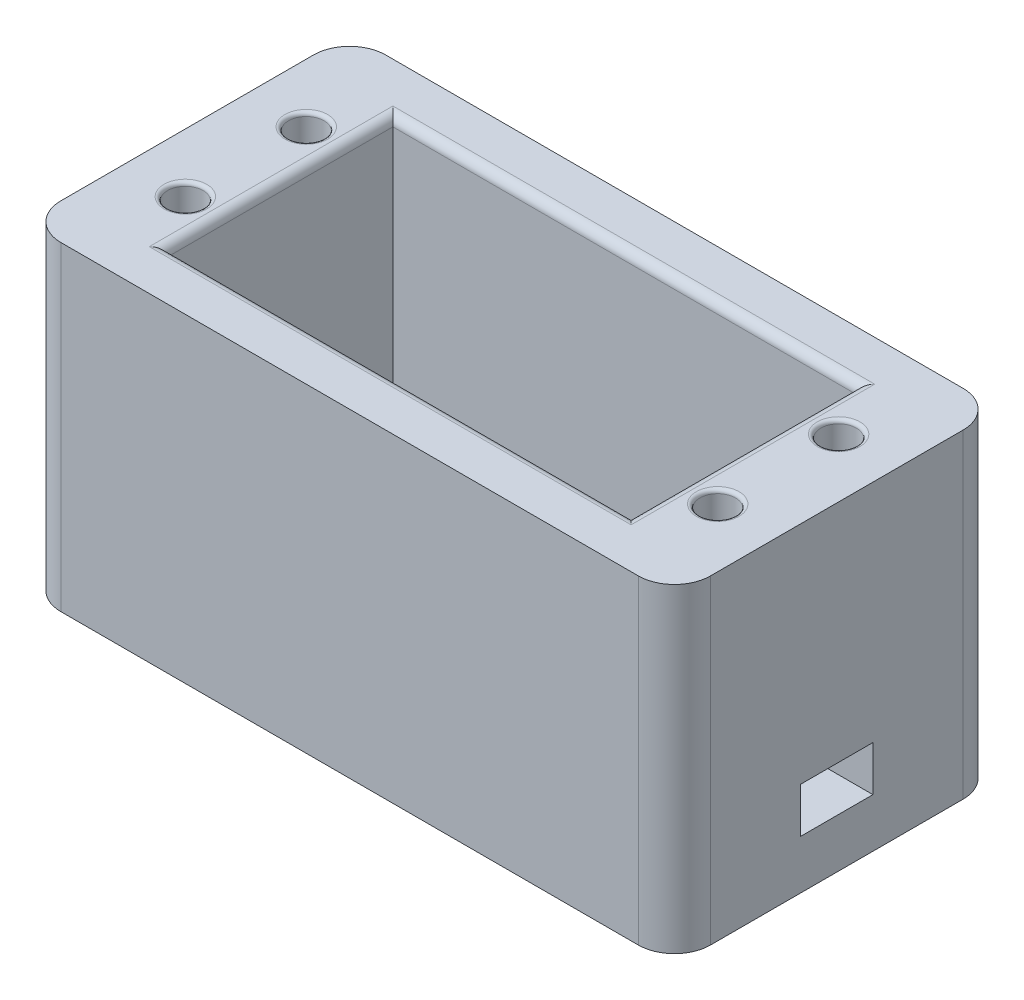
ISO-10303-21;
HEADER;
FILE_DESCRIPTION(('STEP AP214'),'2;1');
FILE_NAME('part.step','',(''),(''),'','','');
FILE_SCHEMA(('AUTOMOTIVE_DESIGN { 1 0 10303 214 1 1 1 1 }'));
ENDSEC;
DATA;
#1=APPLICATION_CONTEXT('core data for automotive mechanical design processes');
#2=APPLICATION_PROTOCOL_DEFINITION('international standard','automotive_design',2000,#1);
#3=PRODUCT_CONTEXT('',#1,'mechanical');
#4=PRODUCT('Part','Part','',(#3));
#5=PRODUCT_RELATED_PRODUCT_CATEGORY('part','',(#4));
#6=PRODUCT_DEFINITION_FORMATION('','',#4);
#7=PRODUCT_DEFINITION_CONTEXT('part definition',#1,'design');
#8=PRODUCT_DEFINITION('design','',#6,#7);
#9=PRODUCT_DEFINITION_SHAPE('','',#8);
#10=(LENGTH_UNIT() NAMED_UNIT(*) SI_UNIT(.MILLI.,.METRE.));
#11=(NAMED_UNIT(*) PLANE_ANGLE_UNIT() SI_UNIT($,.RADIAN.));
#12=(NAMED_UNIT(*) SI_UNIT($,.STERADIAN.) SOLID_ANGLE_UNIT());
#13=UNCERTAINTY_MEASURE_WITH_UNIT(LENGTH_MEASURE(1.E-05),#10,'distance_accuracy_value','');
#14=(GEOMETRIC_REPRESENTATION_CONTEXT(3) GLOBAL_UNCERTAINTY_ASSIGNED_CONTEXT((#13)) GLOBAL_UNIT_ASSIGNED_CONTEXT((#10,
#11,#12)) REPRESENTATION_CONTEXT('',''));
#15=CARTESIAN_POINT('',(0.,0.,0.));
#16=DIRECTION('',(0.,0.,1.));
#17=DIRECTION('',(1.,0.,0.));
#18=AXIS2_PLACEMENT_3D('',#15,#16,#17);
#19=CARTESIAN_POINT('',(45.72,45.,-22.86));
#20=DIRECTION('',(-1.,0.,0.));
#21=DIRECTION('',(0.,0.,1.));
#22=AXIS2_PLACEMENT_3D('',#19,#20,#21);
#23=PLANE('',#22);
#24=DIRECTION('',(0.,0.,-1.));
#25=VECTOR('',#24,1.);
#26=CARTESIAN_POINT('',(45.72,13.255,5.08));
#27=LINE('',#26,#25);
#28=CARTESIAN_POINT('',(45.72,13.255,5.08));
#29=VERTEX_POINT('',#28);
#30=CARTESIAN_POINT('',(45.72,13.255,-5.08));
#31=VERTEX_POINT('',#30);
#32=EDGE_CURVE('E170',#29,#31,#27,.T.);
#33=ORIENTED_EDGE('',*,*,#32,.T.);
#34=DIRECTION('',(0.,-1.,0.));
#35=VECTOR('',#34,1.);
#36=CARTESIAN_POINT('',(45.72,6.905,-5.08));
#37=LINE('',#36,#35);
#38=CARTESIAN_POINT('',(45.72,6.905,-5.08));
#39=VERTEX_POINT('',#38);
#40=EDGE_CURVE('E164',#31,#39,#37,.T.);
#41=ORIENTED_EDGE('',*,*,#40,.T.);
#42=DIRECTION('',(0.,0.,1.));
#43=VECTOR('',#42,1.);
#44=CARTESIAN_POINT('',(45.72,6.905,5.08));
#45=LINE('',#44,#43);
#46=CARTESIAN_POINT('',(45.72,6.905,5.08));
#47=VERTEX_POINT('',#46);
#48=EDGE_CURVE('E173',#39,#47,#45,.T.);
#49=ORIENTED_EDGE('',*,*,#48,.T.);
#50=DIRECTION('',(0.,1.,0.));
#51=VECTOR('',#50,1.);
#52=CARTESIAN_POINT('',(45.72,6.905,5.08));
#53=LINE('',#52,#51);
#54=EDGE_CURVE('E52',#47,#29,#53,.T.);
#55=ORIENTED_EDGE('',*,*,#54,.T.);
#56=EDGE_LOOP('',(#33,#41,#49,#55));
#57=FACE_BOUND('',#56,.T.);
#58=DIRECTION('',(0.,0.,-1.));
#59=VECTOR('',#58,1.);
#60=CARTESIAN_POINT('',(45.72,45.,-22.86));
#61=LINE('',#60,#59);
#62=CARTESIAN_POINT('',(45.72,45.,17.78));
#63=VERTEX_POINT('',#62);
#64=CARTESIAN_POINT('',(45.72,45.,-17.78));
#65=VERTEX_POINT('',#64);
#66=EDGE_CURVE('E236',#63,#65,#61,.T.);
#67=ORIENTED_EDGE('',*,*,#66,.F.);
#68=DIRECTION('',(0.,-1.,0.));
#69=VECTOR('',#68,1.);
#70=CARTESIAN_POINT('',(45.72,45.,17.78));
#71=LINE('',#70,#69);
#72=CARTESIAN_POINT('',(45.72,0.,17.78));
#73=VERTEX_POINT('',#72);
#74=EDGE_CURVE('E292',#63,#73,#71,.T.);
#75=ORIENTED_EDGE('',*,*,#74,.T.);
#76=DIRECTION('',(0.,0.,-1.));
#77=VECTOR('',#76,1.);
#78=CARTESIAN_POINT('',(45.72,0.,-22.86));
#79=LINE('',#78,#77);
#80=CARTESIAN_POINT('',(45.72,0.,-17.78));
#81=VERTEX_POINT('',#80);
#82=EDGE_CURVE('E227',#73,#81,#79,.T.);
#83=ORIENTED_EDGE('',*,*,#82,.T.);
#84=DIRECTION('',(0.,-1.,0.));
#85=VECTOR('',#84,1.);
#86=CARTESIAN_POINT('',(45.72,45.,-17.78));
#87=LINE('',#86,#85);
#88=EDGE_CURVE('E290',#81,#65,#87,.F.);
#89=ORIENTED_EDGE('',*,*,#88,.T.);
#90=EDGE_LOOP('',(#67,#75,#83,#89));
#91=FACE_BOUND('',#90,.T.);
#92=ADVANCED_FACE('F37',(#57,#91),#23,.F.);
#93=CARTESIAN_POINT('',(-45.72,45.,-22.86));
#94=DIRECTION('',(0.,0.,1.));
#95=DIRECTION('',(1.,0.,0.));
#96=AXIS2_PLACEMENT_3D('',#93,#94,#95);
#97=PLANE('',#96);
#98=DIRECTION('',(-1.,0.,0.));
#99=VECTOR('',#98,1.);
#100=CARTESIAN_POINT('',(-45.72,0.,-22.86));
#101=LINE('',#100,#99);
#102=CARTESIAN_POINT('',(40.64,0.,-22.86));
#103=VERTEX_POINT('',#102);
#104=CARTESIAN_POINT('',(-40.64,0.,-22.86));
#105=VERTEX_POINT('',#104);
#106=EDGE_CURVE('E252',#103,#105,#101,.T.);
#107=ORIENTED_EDGE('',*,*,#106,.T.);
#108=DIRECTION('',(0.,-1.,0.));
#109=VECTOR('',#108,1.);
#110=CARTESIAN_POINT('',(-40.64,45.,-22.86));
#111=LINE('',#110,#109);
#112=CARTESIAN_POINT('',(-40.64,45.,-22.86));
#113=VERTEX_POINT('',#112);
#114=EDGE_CURVE('E288',#105,#113,#111,.F.);
#115=ORIENTED_EDGE('',*,*,#114,.T.);
#116=DIRECTION('',(-1.,0.,0.));
#117=VECTOR('',#116,1.);
#118=CARTESIAN_POINT('',(-45.72,45.,-22.86));
#119=LINE('',#118,#117);
#120=CARTESIAN_POINT('',(40.64,45.,-22.86));
#121=VERTEX_POINT('',#120);
#122=EDGE_CURVE('E239',#121,#113,#119,.T.);
#123=ORIENTED_EDGE('',*,*,#122,.F.);
#124=DIRECTION('',(0.,-1.,0.));
#125=VECTOR('',#124,1.);
#126=CARTESIAN_POINT('',(40.64,45.,-22.86));
#127=LINE('',#126,#125);
#128=EDGE_CURVE('E285',#121,#103,#127,.T.);
#129=ORIENTED_EDGE('',*,*,#128,.T.);
#130=EDGE_LOOP('',(#107,#115,#123,#129));
#131=FACE_BOUND('',#130,.T.);
#132=ADVANCED_FACE('F358',(#131),#97,.F.);
#133=CARTESIAN_POINT('',(-45.72,45.,-22.86));
#134=DIRECTION('',(1.,0.,0.));
#135=DIRECTION('',(0.,0.,-1.));
#136=AXIS2_PLACEMENT_3D('',#133,#134,#135);
#137=PLANE('',#136);
#138=DIRECTION('',(0.,0.,1.));
#139=VECTOR('',#138,1.);
#140=CARTESIAN_POINT('',(-45.72,0.,-22.86));
#141=LINE('',#140,#139);
#142=CARTESIAN_POINT('',(-45.72,0.,-17.78));
#143=VERTEX_POINT('',#142);
#144=CARTESIAN_POINT('',(-45.72,0.,17.78));
#145=VERTEX_POINT('',#144);
#146=EDGE_CURVE('E255',#143,#145,#141,.T.);
#147=ORIENTED_EDGE('',*,*,#146,.T.);
#148=DIRECTION('',(0.,-1.,0.));
#149=VECTOR('',#148,1.);
#150=CARTESIAN_POINT('',(-45.72,45.,17.78));
#151=LINE('',#150,#149);
#152=CARTESIAN_POINT('',(-45.72,45.,17.78));
#153=VERTEX_POINT('',#152);
#154=EDGE_CURVE('E275',#145,#153,#151,.F.);
#155=ORIENTED_EDGE('',*,*,#154,.T.);
#156=DIRECTION('',(0.,0.,1.));
#157=VECTOR('',#156,1.);
#158=CARTESIAN_POINT('',(-45.72,45.,-22.86));
#159=LINE('',#158,#157);
#160=CARTESIAN_POINT('',(-45.72,45.,-17.78));
#161=VERTEX_POINT('',#160);
#162=EDGE_CURVE('E243',#161,#153,#159,.T.);
#163=ORIENTED_EDGE('',*,*,#162,.F.);
#164=DIRECTION('',(0.,-1.,0.));
#165=VECTOR('',#164,1.);
#166=CARTESIAN_POINT('',(-45.72,45.,-17.78));
#167=LINE('',#166,#165);
#168=EDGE_CURVE('E272',#161,#143,#167,.T.);
#169=ORIENTED_EDGE('',*,*,#168,.T.);
#170=EDGE_LOOP('',(#147,#155,#163,#169));
#171=FACE_BOUND('',#170,.T.);
#172=ADVANCED_FACE('F365',(#171),#137,.F.);
#173=CARTESIAN_POINT('',(-45.72,45.,22.86));
#174=DIRECTION('',(0.,0.,-1.));
#175=DIRECTION('',(-1.,0.,0.));
#176=AXIS2_PLACEMENT_3D('',#173,#174,#175);
#177=PLANE('',#176);
#178=DIRECTION('',(1.,0.,0.));
#179=VECTOR('',#178,1.);
#180=CARTESIAN_POINT('',(-45.72,45.,22.86));
#181=LINE('',#180,#179);
#182=CARTESIAN_POINT('',(-40.64,45.,22.86));
#183=VERTEX_POINT('',#182);
#184=CARTESIAN_POINT('',(40.64,45.,22.86));
#185=VERTEX_POINT('',#184);
#186=EDGE_CURVE('E246',#183,#185,#181,.T.);
#187=ORIENTED_EDGE('',*,*,#186,.F.);
#188=DIRECTION('',(0.,-1.,0.));
#189=VECTOR('',#188,1.);
#190=CARTESIAN_POINT('',(-40.64,45.,22.86));
#191=LINE('',#190,#189);
#192=CARTESIAN_POINT('',(-40.64,0.,22.86));
#193=VERTEX_POINT('',#192);
#194=EDGE_CURVE('E261',#183,#193,#191,.T.);
#195=ORIENTED_EDGE('',*,*,#194,.T.);
#196=DIRECTION('',(1.,0.,0.));
#197=VECTOR('',#196,1.);
#198=CARTESIAN_POINT('',(-45.72,0.,22.86));
#199=LINE('',#198,#197);
#200=CARTESIAN_POINT('',(40.64,0.,22.86));
#201=VERTEX_POINT('',#200);
#202=EDGE_CURVE('E240',#193,#201,#199,.T.);
#203=ORIENTED_EDGE('',*,*,#202,.T.);
#204=DIRECTION('',(0.,-1.,0.));
#205=VECTOR('',#204,1.);
#206=CARTESIAN_POINT('',(40.64,45.,22.86));
#207=LINE('',#206,#205);
#208=EDGE_CURVE('E249',#201,#185,#207,.F.);
#209=ORIENTED_EDGE('',*,*,#208,.T.);
#210=EDGE_LOOP('',(#187,#195,#203,#209));
#211=FACE_BOUND('',#210,.T.);
#212=ADVANCED_FACE('F463',(#211),#177,.F.);
#213=CARTESIAN_POINT('',(0.,45.,0.));
#214=DIRECTION('',(0.,1.,0.));
#215=DIRECTION('',(0.,0.,1.));
#216=AXIS2_PLACEMENT_3D('',#213,#214,#215);
#217=PLANE('',#216);
#218=CARTESIAN_POINT('',(-37.465,45.,8.509));
#219=DIRECTION('',(0.,1.,0.));
#220=DIRECTION('',(0.,0.,1.));
#221=AXIS2_PLACEMENT_3D('',#218,#219,#220);
#222=CIRCLE('',#221,3.008);
#223=CARTESIAN_POINT('',(-37.465,45.,11.517));
#224=VERTEX_POINT('',#223);
#225=EDGE_CURVE('E333',#224,#224,#222,.F.);
#226=ORIENTED_EDGE('',*,*,#225,.T.);
#227=EDGE_LOOP('',(#226));
#228=FACE_BOUND('',#227,.T.);
#229=CARTESIAN_POINT('',(-37.465,45.,-8.509));
#230=DIRECTION('',(0.,1.,0.));
#231=DIRECTION('',(0.,0.,1.));
#232=AXIS2_PLACEMENT_3D('',#229,#230,#231);
#233=CIRCLE('',#232,3.008);
#234=CARTESIAN_POINT('',(-37.465,45.,-5.501));
#235=VERTEX_POINT('',#234);
#236=EDGE_CURVE('E330',#235,#235,#233,.F.);
#237=ORIENTED_EDGE('',*,*,#236,.T.);
#238=EDGE_LOOP('',(#237));
#239=FACE_BOUND('',#238,.T.);
#240=CARTESIAN_POINT('',(37.465,45.,8.509));
#241=DIRECTION('',(0.,1.,0.));
#242=DIRECTION('',(0.,0.,1.));
#243=AXIS2_PLACEMENT_3D('',#240,#241,#242);
#244=CIRCLE('',#243,3.008);
#245=CARTESIAN_POINT('',(37.465,45.,11.517));
#246=VERTEX_POINT('',#245);
#247=EDGE_CURVE('E327',#246,#246,#244,.F.);
#248=ORIENTED_EDGE('',*,*,#247,.T.);
#249=EDGE_LOOP('',(#248));
#250=FACE_BOUND('',#249,.T.);
#251=CARTESIAN_POINT('',(37.465,45.,-8.509));
#252=DIRECTION('',(0.,1.,0.));
#253=DIRECTION('',(0.,0.,1.));
#254=AXIS2_PLACEMENT_3D('',#251,#252,#253);
#255=CIRCLE('',#254,3.008);
#256=CARTESIAN_POINT('',(37.465,45.,-5.501));
#257=VERTEX_POINT('',#256);
#258=EDGE_CURVE('E324',#257,#257,#255,.F.);
#259=ORIENTED_EDGE('',*,*,#258,.T.);
#260=EDGE_LOOP('',(#259));
#261=FACE_BOUND('',#260,.T.);
#262=DIRECTION('',(1.,0.,0.));
#263=VECTOR('',#262,1.);
#264=CARTESIAN_POINT('',(-32.639,45.,17.145));
#265=LINE('',#264,#263);
#266=CARTESIAN_POINT('',(33.909,45.,17.145));
#267=VERTEX_POINT('',#266);
#268=CARTESIAN_POINT('',(-33.909,45.,17.145));
#269=VERTEX_POINT('',#268);
#270=EDGE_CURVE('E302',#267,#269,#265,.F.);
#271=ORIENTED_EDGE('',*,*,#270,.T.);
#272=DIRECTION('',(0.,0.,1.));
#273=VECTOR('',#272,1.);
#274=CARTESIAN_POINT('',(-33.909,45.,-15.875));
#275=LINE('',#274,#273);
#276=CARTESIAN_POINT('',(-33.909,45.,-17.145));
#277=VERTEX_POINT('',#276);
#278=EDGE_CURVE('E304',#269,#277,#275,.F.);
#279=ORIENTED_EDGE('',*,*,#278,.T.);
#280=DIRECTION('',(-1.,0.,0.));
#281=VECTOR('',#280,1.);
#282=CARTESIAN_POINT('',(32.639,45.,-17.145));
#283=LINE('',#282,#281);
#284=CARTESIAN_POINT('',(33.909,45.,-17.145));
#285=VERTEX_POINT('',#284);
#286=EDGE_CURVE('E298',#277,#285,#283,.F.);
#287=ORIENTED_EDGE('',*,*,#286,.T.);
#288=DIRECTION('',(0.,0.,-1.));
#289=VECTOR('',#288,1.);
#290=CARTESIAN_POINT('',(33.909,45.,15.875));
#291=LINE('',#290,#289);
#292=EDGE_CURVE('E300',#285,#267,#291,.F.);
#293=ORIENTED_EDGE('',*,*,#292,.T.);
#294=EDGE_LOOP('',(#271,#279,#287,#293));
#295=FACE_BOUND('',#294,.T.);
#296=ORIENTED_EDGE('',*,*,#162,.T.);
#297=CARTESIAN_POINT('',(-40.64,45.,17.78));
#298=DIRECTION('',(0.,1.,0.));
#299=DIRECTION('',(0.,0.,1.));
#300=AXIS2_PLACEMENT_3D('',#297,#298,#299);
#301=CIRCLE('',#300,5.08);
#302=EDGE_CURVE('E283',#153,#183,#301,.T.);
#303=ORIENTED_EDGE('',*,*,#302,.T.);
#304=ORIENTED_EDGE('',*,*,#186,.T.);
#305=CARTESIAN_POINT('',(40.64,45.,17.78));
#306=DIRECTION('',(0.,1.,0.));
#307=DIRECTION('',(0.,0.,1.));
#308=AXIS2_PLACEMENT_3D('',#305,#306,#307);
#309=CIRCLE('',#308,5.08);
#310=EDGE_CURVE('E279',#185,#63,#309,.T.);
#311=ORIENTED_EDGE('',*,*,#310,.T.);
#312=ORIENTED_EDGE('',*,*,#66,.T.);
#313=CARTESIAN_POINT('',(40.64,45.,-17.78));
#314=DIRECTION('',(0.,1.,0.));
#315=DIRECTION('',(0.,0.,1.));
#316=AXIS2_PLACEMENT_3D('',#313,#314,#315);
#317=CIRCLE('',#316,5.08);
#318=EDGE_CURVE('E277',#65,#121,#317,.T.);
#319=ORIENTED_EDGE('',*,*,#318,.T.);
#320=ORIENTED_EDGE('',*,*,#122,.T.);
#321=CARTESIAN_POINT('',(-40.64,45.,-17.78));
#322=DIRECTION('',(0.,1.,0.));
#323=DIRECTION('',(0.,0.,1.));
#324=AXIS2_PLACEMENT_3D('',#321,#322,#323);
#325=CIRCLE('',#324,5.08);
#326=EDGE_CURVE('E281',#113,#161,#325,.T.);
#327=ORIENTED_EDGE('',*,*,#326,.T.);
#328=EDGE_LOOP('',(#296,#303,#304,#311,#312,#319,#320,#327));
#329=FACE_BOUND('',#328,.T.);
#330=ADVANCED_FACE('F460',(#228,#239,#250,#261,#295,#329),#217,.T.);
#331=CARTESIAN_POINT('',(0.,0.,0.));
#332=DIRECTION('',(0.,1.,0.));
#333=DIRECTION('',(0.,0.,1.));
#334=AXIS2_PLACEMENT_3D('',#331,#332,#333);
#335=PLANE('',#334);
#336=ORIENTED_EDGE('',*,*,#202,.F.);
#337=CARTESIAN_POINT('',(-40.64,0.,17.78));
#338=DIRECTION('',(0.,1.,0.));
#339=DIRECTION('',(0.,0.,1.));
#340=AXIS2_PLACEMENT_3D('',#337,#338,#339);
#341=CIRCLE('',#340,5.08);
#342=EDGE_CURVE('E270',#193,#145,#341,.F.);
#343=ORIENTED_EDGE('',*,*,#342,.T.);
#344=ORIENTED_EDGE('',*,*,#146,.F.);
#345=CARTESIAN_POINT('',(-40.64,0.,-17.78));
#346=DIRECTION('',(0.,1.,0.));
#347=DIRECTION('',(0.,0.,1.));
#348=AXIS2_PLACEMENT_3D('',#345,#346,#347);
#349=CIRCLE('',#348,5.08);
#350=EDGE_CURVE('E268',#143,#105,#349,.F.);
#351=ORIENTED_EDGE('',*,*,#350,.T.);
#352=ORIENTED_EDGE('',*,*,#106,.F.);
#353=CARTESIAN_POINT('',(40.64,0.,-17.78));
#354=DIRECTION('',(0.,1.,0.));
#355=DIRECTION('',(0.,0.,1.));
#356=AXIS2_PLACEMENT_3D('',#353,#354,#355);
#357=CIRCLE('',#356,5.08);
#358=EDGE_CURVE('E264',#103,#81,#357,.F.);
#359=ORIENTED_EDGE('',*,*,#358,.T.);
#360=ORIENTED_EDGE('',*,*,#82,.F.);
#361=CARTESIAN_POINT('',(40.64,0.,17.78));
#362=DIRECTION('',(0.,1.,0.));
#363=DIRECTION('',(0.,0.,1.));
#364=AXIS2_PLACEMENT_3D('',#361,#362,#363);
#365=CIRCLE('',#364,5.08);
#366=EDGE_CURVE('E266',#73,#201,#365,.F.);
#367=ORIENTED_EDGE('',*,*,#366,.T.);
#368=EDGE_LOOP('',(#336,#343,#344,#351,#352,#359,#360,#367));
#369=FACE_BOUND('',#368,.T.);
#370=ADVANCED_FACE('F458',(#369),#335,.F.);
#371=CARTESIAN_POINT('',(32.639,5.,-15.875));
#372=DIRECTION('',(1.,0.,0.));
#373=DIRECTION('',(0.,0.,-1.));
#374=AXIS2_PLACEMENT_3D('',#371,#372,#373);
#375=PLANE('',#374);
#376=DIRECTION('',(0.,0.,1.));
#377=VECTOR('',#376,1.);
#378=CARTESIAN_POINT('',(32.639,6.905,5.08));
#379=LINE('',#378,#377);
#380=CARTESIAN_POINT('',(32.639,6.905,-5.08));
#381=VERTEX_POINT('',#380);
#382=CARTESIAN_POINT('',(32.639,6.905,5.08));
#383=VERTEX_POINT('',#382);
#384=EDGE_CURVE('E188',#381,#383,#379,.T.);
#385=ORIENTED_EDGE('',*,*,#384,.F.);
#386=DIRECTION('',(0.,-1.,0.));
#387=VECTOR('',#386,1.);
#388=CARTESIAN_POINT('',(32.639,6.905,-5.08));
#389=LINE('',#388,#387);
#390=CARTESIAN_POINT('',(32.639,13.255,-5.08));
#391=VERTEX_POINT('',#390);
#392=EDGE_CURVE('E60',#391,#381,#389,.T.);
#393=ORIENTED_EDGE('',*,*,#392,.F.);
#394=DIRECTION('',(0.,0.,-1.));
#395=VECTOR('',#394,1.);
#396=CARTESIAN_POINT('',(32.639,13.255,5.08));
#397=LINE('',#396,#395);
#398=CARTESIAN_POINT('',(32.639,13.255,5.08));
#399=VERTEX_POINT('',#398);
#400=EDGE_CURVE('E179',#399,#391,#397,.T.);
#401=ORIENTED_EDGE('',*,*,#400,.F.);
#402=DIRECTION('',(0.,1.,0.));
#403=VECTOR('',#402,1.);
#404=CARTESIAN_POINT('',(32.639,6.905,5.08));
#405=LINE('',#404,#403);
#406=EDGE_CURVE('E182',#383,#399,#405,.T.);
#407=ORIENTED_EDGE('',*,*,#406,.F.);
#408=EDGE_LOOP('',(#385,#393,#401,#407));
#409=FACE_BOUND('',#408,.T.);
#410=DIRECTION('',(0.,1.,0.));
#411=VECTOR('',#410,1.);
#412=CARTESIAN_POINT('',(32.639,5.,15.875));
#413=LINE('',#412,#411);
#414=CARTESIAN_POINT('',(32.639,5.,15.875));
#415=VERTEX_POINT('',#414);
#416=CARTESIAN_POINT('',(32.639,43.73,15.875));
#417=VERTEX_POINT('',#416);
#418=EDGE_CURVE('E224',#415,#417,#413,.T.);
#419=ORIENTED_EDGE('',*,*,#418,.T.);
#420=DIRECTION('',(0.,0.,-1.));
#421=VECTOR('',#420,1.);
#422=CARTESIAN_POINT('',(32.639,43.73,-15.875));
#423=LINE('',#422,#421);
#424=CARTESIAN_POINT('',(32.639,43.73,-15.875));
#425=VERTEX_POINT('',#424);
#426=EDGE_CURVE('E309',#417,#425,#423,.T.);
#427=ORIENTED_EDGE('',*,*,#426,.T.);
#428=DIRECTION('',(0.,1.,0.));
#429=VECTOR('',#428,1.);
#430=CARTESIAN_POINT('',(32.639,5.,-15.875));
#431=LINE('',#430,#429);
#432=CARTESIAN_POINT('',(32.639,5.,-15.875));
#433=VERTEX_POINT('',#432);
#434=EDGE_CURVE('E223',#433,#425,#431,.T.);
#435=ORIENTED_EDGE('',*,*,#434,.F.);
#436=DIRECTION('',(0.,0.,-1.));
#437=VECTOR('',#436,1.);
#438=CARTESIAN_POINT('',(32.639,5.,-15.875));
#439=LINE('',#438,#437);
#440=EDGE_CURVE('E211',#415,#433,#439,.T.);
#441=ORIENTED_EDGE('',*,*,#440,.F.);
#442=EDGE_LOOP('',(#419,#427,#435,#441));
#443=FACE_BOUND('',#442,.T.);
#444=ADVANCED_FACE('F449',(#409,#443),#375,.F.);
#445=CARTESIAN_POINT('',(-32.639,5.,15.875));
#446=DIRECTION('',(0.,0.,1.));
#447=DIRECTION('',(1.,0.,0.));
#448=AXIS2_PLACEMENT_3D('',#445,#446,#447);
#449=PLANE('',#448);
#450=DIRECTION('',(0.,1.,0.));
#451=VECTOR('',#450,1.);
#452=CARTESIAN_POINT('',(-32.639,5.,15.875));
#453=LINE('',#452,#451);
#454=CARTESIAN_POINT('',(-32.639,5.,15.875));
#455=VERTEX_POINT('',#454);
#456=CARTESIAN_POINT('',(-32.639,43.73,15.875));
#457=VERTEX_POINT('',#456);
#458=EDGE_CURVE('E228',#455,#457,#453,.T.);
#459=ORIENTED_EDGE('',*,*,#458,.T.);
#460=DIRECTION('',(1.,0.,0.));
#461=VECTOR('',#460,1.);
#462=CARTESIAN_POINT('',(32.639,43.73,15.875));
#463=LINE('',#462,#461);
#464=EDGE_CURVE('E307',#457,#417,#463,.T.);
#465=ORIENTED_EDGE('',*,*,#464,.T.);
#466=ORIENTED_EDGE('',*,*,#418,.F.);
#467=DIRECTION('',(1.,0.,0.));
#468=VECTOR('',#467,1.);
#469=CARTESIAN_POINT('',(-32.639,5.,15.875));
#470=LINE('',#469,#468);
#471=EDGE_CURVE('E220',#455,#415,#470,.T.);
#472=ORIENTED_EDGE('',*,*,#471,.F.);
#473=EDGE_LOOP('',(#459,#465,#466,#472));
#474=FACE_BOUND('',#473,.T.);
#475=ADVANCED_FACE('F445',(#474),#449,.F.);
#476=CARTESIAN_POINT('',(-32.639,5.,-15.875));
#477=DIRECTION('',(-1.,0.,0.));
#478=DIRECTION('',(0.,0.,1.));
#479=AXIS2_PLACEMENT_3D('',#476,#477,#478);
#480=PLANE('',#479);
#481=DIRECTION('',(0.,1.,0.));
#482=VECTOR('',#481,1.);
#483=CARTESIAN_POINT('',(-32.639,5.,-15.875));
#484=LINE('',#483,#482);
#485=CARTESIAN_POINT('',(-32.639,5.,-15.875));
#486=VERTEX_POINT('',#485);
#487=CARTESIAN_POINT('',(-32.639,43.73,-15.875));
#488=VERTEX_POINT('',#487);
#489=EDGE_CURVE('E231',#486,#488,#484,.T.);
#490=ORIENTED_EDGE('',*,*,#489,.T.);
#491=DIRECTION('',(0.,0.,1.));
#492=VECTOR('',#491,1.);
#493=CARTESIAN_POINT('',(-32.639,43.73,15.875));
#494=LINE('',#493,#492);
#495=EDGE_CURVE('E295',#488,#457,#494,.T.);
#496=ORIENTED_EDGE('',*,*,#495,.T.);
#497=ORIENTED_EDGE('',*,*,#458,.F.);
#498=DIRECTION('',(0.,0.,1.));
#499=VECTOR('',#498,1.);
#500=CARTESIAN_POINT('',(-32.639,5.,-15.875));
#501=LINE('',#500,#499);
#502=EDGE_CURVE('E217',#486,#455,#501,.T.);
#503=ORIENTED_EDGE('',*,*,#502,.F.);
#504=EDGE_LOOP('',(#490,#496,#497,#503));
#505=FACE_BOUND('',#504,.T.);
#506=ADVANCED_FACE('F448',(#505),#480,.F.);
#507=CARTESIAN_POINT('',(-32.639,5.,-15.875));
#508=DIRECTION('',(0.,0.,-1.));
#509=DIRECTION('',(-1.,0.,0.));
#510=AXIS2_PLACEMENT_3D('',#507,#508,#509);
#511=PLANE('',#510);
#512=ORIENTED_EDGE('',*,*,#434,.T.);
#513=DIRECTION('',(-1.,0.,0.));
#514=VECTOR('',#513,1.);
#515=CARTESIAN_POINT('',(-32.639,43.73,-15.875));
#516=LINE('',#515,#514);
#517=EDGE_CURVE('E311',#425,#488,#516,.T.);
#518=ORIENTED_EDGE('',*,*,#517,.T.);
#519=ORIENTED_EDGE('',*,*,#489,.F.);
#520=DIRECTION('',(-1.,0.,0.));
#521=VECTOR('',#520,1.);
#522=CARTESIAN_POINT('',(-32.639,5.,-15.875));
#523=LINE('',#522,#521);
#524=EDGE_CURVE('E214',#433,#486,#523,.T.);
#525=ORIENTED_EDGE('',*,*,#524,.F.);
#526=EDGE_LOOP('',(#512,#518,#519,#525));
#527=FACE_BOUND('',#526,.T.);
#528=ADVANCED_FACE('F443',(#527),#511,.F.);
#529=CARTESIAN_POINT('',(0.,5.,0.));
#530=DIRECTION('',(0.,1.,0.));
#531=DIRECTION('',(0.,0.,1.));
#532=AXIS2_PLACEMENT_3D('',#529,#530,#531);
#533=PLANE('',#532);
#534=ORIENTED_EDGE('',*,*,#440,.T.);
#535=ORIENTED_EDGE('',*,*,#524,.T.);
#536=ORIENTED_EDGE('',*,*,#502,.T.);
#537=ORIENTED_EDGE('',*,*,#471,.T.);
#538=EDGE_LOOP('',(#534,#535,#536,#537));
#539=FACE_BOUND('',#538,.T.);
#540=ADVANCED_FACE('F439',(#539),#533,.T.);
#541=CARTESIAN_POINT('',(37.465,19.6,-8.509));
#542=DIRECTION('',(0.,1.,0.));
#543=DIRECTION('',(0.,0.,1.));
#544=AXIS2_PLACEMENT_3D('',#541,#542,#543);
#545=CYLINDRICAL_SURFACE('',#544,2.5);
#546=CARTESIAN_POINT('',(37.465,44.492,-8.509));
#547=DIRECTION('',(0.,1.,0.));
#548=DIRECTION('',(0.,0.,1.));
#549=AXIS2_PLACEMENT_3D('',#546,#547,#548);
#550=CIRCLE('',#549,2.5);
#551=CARTESIAN_POINT('',(37.465,44.492,-6.009));
#552=VERTEX_POINT('',#551);
#553=EDGE_CURVE('E11',#552,#552,#550,.T.);
#554=ORIENTED_EDGE('',*,*,#553,.T.);
#555=EDGE_LOOP('',(#554));
#556=FACE_BOUND('',#555,.T.);
#557=CARTESIAN_POINT('',(37.465,19.6,-8.509));
#558=DIRECTION('',(0.,1.,0.));
#559=DIRECTION('',(0.,0.,1.));
#560=AXIS2_PLACEMENT_3D('',#557,#558,#559);
#561=CIRCLE('',#560,2.5);
#562=CARTESIAN_POINT('',(37.465,19.6,-6.009));
#563=VERTEX_POINT('',#562);
#564=EDGE_CURVE('E201',#563,#563,#561,.T.);
#565=ORIENTED_EDGE('',*,*,#564,.F.);
#566=EDGE_LOOP('',(#565));
#567=FACE_BOUND('',#566,.T.);
#568=ADVANCED_FACE('F435',(#556,#567),#545,.F.);
#569=CARTESIAN_POINT('',(37.465,19.6,-8.509));
#570=DIRECTION('',(0.,1.,0.));
#571=DIRECTION('',(0.,0.,1.));
#572=AXIS2_PLACEMENT_3D('',#569,#570,#571);
#573=PLANE('',#572);
#574=ORIENTED_EDGE('',*,*,#564,.T.);
#575=EDGE_LOOP('',(#574));
#576=FACE_BOUND('',#575,.T.);
#577=ADVANCED_FACE('F432',(#576),#573,.T.);
#578=CARTESIAN_POINT('',(37.465,19.6,8.509));
#579=DIRECTION('',(0.,1.,0.));
#580=DIRECTION('',(0.,0.,1.));
#581=AXIS2_PLACEMENT_3D('',#578,#579,#580);
#582=CYLINDRICAL_SURFACE('',#581,2.5);
#583=CARTESIAN_POINT('',(37.465,44.492,8.509));
#584=DIRECTION('',(0.,1.,0.));
#585=DIRECTION('',(0.,0.,1.));
#586=AXIS2_PLACEMENT_3D('',#583,#584,#585);
#587=CIRCLE('',#586,2.5);
#588=CARTESIAN_POINT('',(37.465,44.492,11.009));
#589=VERTEX_POINT('',#588);
#590=EDGE_CURVE('E45',#589,#589,#587,.T.);
#591=ORIENTED_EDGE('',*,*,#590,.T.);
#592=EDGE_LOOP('',(#591));
#593=FACE_BOUND('',#592,.T.);
#594=CARTESIAN_POINT('',(37.465,19.6,8.509));
#595=DIRECTION('',(0.,1.,0.));
#596=DIRECTION('',(0.,0.,1.));
#597=AXIS2_PLACEMENT_3D('',#594,#595,#596);
#598=CIRCLE('',#597,2.5);
#599=CARTESIAN_POINT('',(37.465,19.6,11.009));
#600=VERTEX_POINT('',#599);
#601=EDGE_CURVE('E198',#600,#600,#598,.T.);
#602=ORIENTED_EDGE('',*,*,#601,.F.);
#603=EDGE_LOOP('',(#602));
#604=FACE_BOUND('',#603,.T.);
#605=ADVANCED_FACE('F341',(#593,#604),#582,.F.);
#606=CARTESIAN_POINT('',(37.465,19.6,8.509));
#607=DIRECTION('',(0.,1.,0.));
#608=DIRECTION('',(0.,0.,1.));
#609=AXIS2_PLACEMENT_3D('',#606,#607,#608);
#610=PLANE('',#609);
#611=ORIENTED_EDGE('',*,*,#601,.T.);
#612=EDGE_LOOP('',(#611));
#613=FACE_BOUND('',#612,.T.);
#614=ADVANCED_FACE('F415',(#613),#610,.T.);
#615=CARTESIAN_POINT('',(-37.465,19.6,8.509));
#616=DIRECTION('',(0.,1.,0.));
#617=DIRECTION('',(0.,0.,1.));
#618=AXIS2_PLACEMENT_3D('',#615,#616,#617);
#619=CYLINDRICAL_SURFACE('',#618,2.5);
#620=CARTESIAN_POINT('',(-37.465,44.492,8.509));
#621=DIRECTION('',(0.,1.,0.));
#622=DIRECTION('',(0.,0.,1.));
#623=AXIS2_PLACEMENT_3D('',#620,#621,#622);
#624=CIRCLE('',#623,2.5);
#625=CARTESIAN_POINT('',(-37.465,44.492,11.009));
#626=VERTEX_POINT('',#625);
#627=EDGE_CURVE('E313',#626,#626,#624,.T.);
#628=ORIENTED_EDGE('',*,*,#627,.T.);
#629=EDGE_LOOP('',(#628));
#630=FACE_BOUND('',#629,.T.);
#631=CARTESIAN_POINT('',(-37.465,19.6,8.509));
#632=DIRECTION('',(0.,1.,0.));
#633=DIRECTION('',(0.,0.,-1.));
#634=AXIS2_PLACEMENT_3D('',#631,#632,#633);
#635=CIRCLE('',#634,2.5);
#636=CARTESIAN_POINT('',(-37.465,19.6,6.009));
#637=VERTEX_POINT('',#636);
#638=EDGE_CURVE('E202',#637,#637,#635,.T.);
#639=ORIENTED_EDGE('',*,*,#638,.F.);
#640=EDGE_LOOP('',(#639));
#641=FACE_BOUND('',#640,.T.);
#642=ADVANCED_FACE('F411',(#630,#641),#619,.F.);
#643=CARTESIAN_POINT('',(-37.465,19.6,8.509));
#644=DIRECTION('',(0.,-1.,0.));
#645=DIRECTION('',(0.,0.,-1.));
#646=AXIS2_PLACEMENT_3D('',#643,#644,#645);
#647=PLANE('',#646);
#648=ORIENTED_EDGE('',*,*,#638,.T.);
#649=EDGE_LOOP('',(#648));
#650=FACE_BOUND('',#649,.T.);
#651=ADVANCED_FACE('F414',(#650),#647,.F.);
#652=CARTESIAN_POINT('',(-37.465,19.6,-8.509));
#653=DIRECTION('',(0.,1.,0.));
#654=DIRECTION('',(0.,0.,1.));
#655=AXIS2_PLACEMENT_3D('',#652,#653,#654);
#656=CYLINDRICAL_SURFACE('',#655,2.5);
#657=CARTESIAN_POINT('',(-37.465,44.492,-8.509));
#658=DIRECTION('',(0.,1.,0.));
#659=DIRECTION('',(0.,0.,1.));
#660=AXIS2_PLACEMENT_3D('',#657,#658,#659);
#661=CIRCLE('',#660,2.5);
#662=CARTESIAN_POINT('',(-37.465,44.492,-6.009));
#663=VERTEX_POINT('',#662);
#664=EDGE_CURVE('E336',#663,#663,#661,.T.);
#665=ORIENTED_EDGE('',*,*,#664,.T.);
#666=EDGE_LOOP('',(#665));
#667=FACE_BOUND('',#666,.T.);
#668=CARTESIAN_POINT('',(-37.465,19.6,-8.509));
#669=DIRECTION('',(0.,1.,0.));
#670=DIRECTION('',(0.,0.,-1.));
#671=AXIS2_PLACEMENT_3D('',#668,#669,#670);
#672=CIRCLE('',#671,2.5);
#673=CARTESIAN_POINT('',(-37.465,19.6,-11.009));
#674=VERTEX_POINT('',#673);
#675=EDGE_CURVE('E205',#674,#674,#672,.T.);
#676=ORIENTED_EDGE('',*,*,#675,.F.);
#677=EDGE_LOOP('',(#676));
#678=FACE_BOUND('',#677,.T.);
#679=ADVANCED_FACE('F420',(#667,#678),#656,.F.);
#680=CARTESIAN_POINT('',(-37.465,19.6,-8.509));
#681=DIRECTION('',(0.,-1.,0.));
#682=DIRECTION('',(0.,0.,-1.));
#683=AXIS2_PLACEMENT_3D('',#680,#681,#682);
#684=PLANE('',#683);
#685=ORIENTED_EDGE('',*,*,#675,.T.);
#686=EDGE_LOOP('',(#685));
#687=FACE_BOUND('',#686,.T.);
#688=ADVANCED_FACE('F374',(#687),#684,.F.);
#689=CARTESIAN_POINT('',(-40.64,45.,17.78));
#690=DIRECTION('',(0.,-1.,0.));
#691=DIRECTION('',(0.,0.,-1.));
#692=AXIS2_PLACEMENT_3D('',#689,#690,#691);
#693=CYLINDRICAL_SURFACE('',#692,5.08);
#694=ORIENTED_EDGE('',*,*,#302,.F.);
#695=ORIENTED_EDGE('',*,*,#154,.F.);
#696=ORIENTED_EDGE('',*,*,#342,.F.);
#697=ORIENTED_EDGE('',*,*,#194,.F.);
#698=EDGE_LOOP('',(#694,#695,#696,#697));
#699=FACE_BOUND('',#698,.T.);
#700=ADVANCED_FACE('F370',(#699),#693,.T.);
#701=CARTESIAN_POINT('',(-40.64,45.,-17.78));
#702=DIRECTION('',(0.,-1.,0.));
#703=DIRECTION('',(0.,0.,-1.));
#704=AXIS2_PLACEMENT_3D('',#701,#702,#703);
#705=CYLINDRICAL_SURFACE('',#704,5.08);
#706=ORIENTED_EDGE('',*,*,#326,.F.);
#707=ORIENTED_EDGE('',*,*,#114,.F.);
#708=ORIENTED_EDGE('',*,*,#350,.F.);
#709=ORIENTED_EDGE('',*,*,#168,.F.);
#710=EDGE_LOOP('',(#706,#707,#708,#709));
#711=FACE_BOUND('',#710,.T.);
#712=ADVANCED_FACE('F373',(#711),#705,.T.);
#713=CARTESIAN_POINT('',(40.64,45.,17.78));
#714=DIRECTION('',(0.,-1.,0.));
#715=DIRECTION('',(0.,0.,-1.));
#716=AXIS2_PLACEMENT_3D('',#713,#714,#715);
#717=CYLINDRICAL_SURFACE('',#716,5.08);
#718=ORIENTED_EDGE('',*,*,#310,.F.);
#719=ORIENTED_EDGE('',*,*,#208,.F.);
#720=ORIENTED_EDGE('',*,*,#366,.F.);
#721=ORIENTED_EDGE('',*,*,#74,.F.);
#722=EDGE_LOOP('',(#718,#719,#720,#721));
#723=FACE_BOUND('',#722,.T.);
#724=ADVANCED_FACE('F378',(#723),#717,.T.);
#725=CARTESIAN_POINT('',(40.64,45.,-17.78));
#726=DIRECTION('',(0.,-1.,0.));
#727=DIRECTION('',(0.,0.,-1.));
#728=AXIS2_PLACEMENT_3D('',#725,#726,#727);
#729=CYLINDRICAL_SURFACE('',#728,5.08);
#730=ORIENTED_EDGE('',*,*,#318,.F.);
#731=ORIENTED_EDGE('',*,*,#88,.F.);
#732=ORIENTED_EDGE('',*,*,#358,.F.);
#733=ORIENTED_EDGE('',*,*,#128,.F.);
#734=EDGE_LOOP('',(#730,#731,#732,#733));
#735=FACE_BOUND('',#734,.T.);
#736=ADVANCED_FACE('F382',(#735),#729,.T.);
#737=CARTESIAN_POINT('',(33.909,43.73,-15.875));
#738=DIRECTION('',(0.,0.,1.));
#739=DIRECTION('',(1.,0.,0.));
#740=AXIS2_PLACEMENT_3D('',#737,#738,#739);
#741=CYLINDRICAL_SURFACE('',#740,1.27);
#742=CARTESIAN_POINT('',(33.909,43.73,17.145));
#743=DIRECTION('',(-0.707106781186547,0.,0.707106781186548));
#744=DIRECTION('',(-0.707106781186548,0.,-0.707106781186547));
#745=AXIS2_PLACEMENT_3D('',#742,#743,#744);
#746=ELLIPSE('',#745,1.79605122421383,1.27);
#747=EDGE_CURVE('E317',#267,#417,#746,.T.);
#748=ORIENTED_EDGE('',*,*,#747,.F.);
#749=ORIENTED_EDGE('',*,*,#292,.F.);
#750=CARTESIAN_POINT('',(33.909,43.73,-17.145));
#751=DIRECTION('',(0.707106781186548,0.,0.707106781186547));
#752=DIRECTION('',(-0.707106781186547,0.,0.707106781186548));
#753=AXIS2_PLACEMENT_3D('',#750,#751,#752);
#754=ELLIPSE('',#753,1.79605122421383,1.27);
#755=EDGE_CURVE('E208',#425,#285,#754,.F.);
#756=ORIENTED_EDGE('',*,*,#755,.F.);
#757=ORIENTED_EDGE('',*,*,#426,.F.);
#758=EDGE_LOOP('',(#748,#749,#756,#757));
#759=FACE_BOUND('',#758,.T.);
#760=ADVANCED_FACE('F386',(#759),#741,.T.);
#761=CARTESIAN_POINT('',(-32.639,43.73,-17.145));
#762=DIRECTION('',(1.,0.,0.));
#763=DIRECTION('',(0.,0.,-1.));
#764=AXIS2_PLACEMENT_3D('',#761,#762,#763);
#765=CYLINDRICAL_SURFACE('',#764,1.27);
#766=ORIENTED_EDGE('',*,*,#755,.T.);
#767=ORIENTED_EDGE('',*,*,#286,.F.);
#768=CARTESIAN_POINT('',(-33.909,43.73,-17.145));
#769=DIRECTION('',(0.707106781186547,0.,-0.707106781186548));
#770=DIRECTION('',(-0.707106781186548,0.,-0.707106781186547));
#771=AXIS2_PLACEMENT_3D('',#768,#769,#770);
#772=ELLIPSE('',#771,1.79605122421383,1.27);
#773=EDGE_CURVE('E315',#488,#277,#772,.F.);
#774=ORIENTED_EDGE('',*,*,#773,.F.);
#775=ORIENTED_EDGE('',*,*,#517,.F.);
#776=EDGE_LOOP('',(#766,#767,#774,#775));
#777=FACE_BOUND('',#776,.T.);
#778=ADVANCED_FACE('F395',(#777),#765,.T.);
#779=CARTESIAN_POINT('',(-32.639,43.73,17.145));
#780=DIRECTION('',(-1.,0.,0.));
#781=DIRECTION('',(0.,0.,1.));
#782=AXIS2_PLACEMENT_3D('',#779,#780,#781);
#783=CYLINDRICAL_SURFACE('',#782,1.27);
#784=ORIENTED_EDGE('',*,*,#747,.T.);
#785=ORIENTED_EDGE('',*,*,#464,.F.);
#786=CARTESIAN_POINT('',(-33.909,43.73,17.145));
#787=DIRECTION('',(-0.707106781186548,0.,-0.707106781186547));
#788=DIRECTION('',(0.707106781186547,0.,-0.707106781186548));
#789=AXIS2_PLACEMENT_3D('',#786,#787,#788);
#790=ELLIPSE('',#789,1.79605122421383,1.27);
#791=EDGE_CURVE('E194',#269,#457,#790,.T.);
#792=ORIENTED_EDGE('',*,*,#791,.F.);
#793=ORIENTED_EDGE('',*,*,#270,.F.);
#794=EDGE_LOOP('',(#784,#785,#792,#793));
#795=FACE_BOUND('',#794,.T.);
#796=ADVANCED_FACE('F391',(#795),#783,.T.);
#797=CARTESIAN_POINT('',(-33.909,43.73,-15.875));
#798=DIRECTION('',(0.,0.,-1.));
#799=DIRECTION('',(-1.,0.,0.));
#800=AXIS2_PLACEMENT_3D('',#797,#798,#799);
#801=CYLINDRICAL_SURFACE('',#800,1.27);
#802=ORIENTED_EDGE('',*,*,#773,.T.);
#803=ORIENTED_EDGE('',*,*,#278,.F.);
#804=ORIENTED_EDGE('',*,*,#791,.T.);
#805=ORIENTED_EDGE('',*,*,#495,.F.);
#806=EDGE_LOOP('',(#802,#803,#804,#805));
#807=FACE_BOUND('',#806,.T.);
#808=ADVANCED_FACE('F388',(#807),#801,.T.);
#809=CARTESIAN_POINT('',(-37.465,44.492,8.509));
#810=DIRECTION('',(0.,1.,0.));
#811=DIRECTION('',(0.,0.,1.));
#812=AXIS2_PLACEMENT_3D('',#809,#810,#811);
#813=TOROIDAL_SURFACE('',#812,3.008,0.508);
#814=ORIENTED_EDGE('',*,*,#225,.F.);
#815=EDGE_LOOP('',(#814));
#816=FACE_BOUND('',#815,.T.);
#817=ORIENTED_EDGE('',*,*,#627,.F.);
#818=EDGE_LOOP('',(#817));
#819=FACE_BOUND('',#818,.T.);
#820=ADVANCED_FACE('F353',(#816,#819),#813,.T.);
#821=CARTESIAN_POINT('',(-37.465,44.492,-8.509));
#822=DIRECTION('',(0.,1.,0.));
#823=DIRECTION('',(0.,0.,1.));
#824=AXIS2_PLACEMENT_3D('',#821,#822,#823);
#825=TOROIDAL_SURFACE('',#824,3.008,0.508);
#826=ORIENTED_EDGE('',*,*,#236,.F.);
#827=EDGE_LOOP('',(#826));
#828=FACE_BOUND('',#827,.T.);
#829=ORIENTED_EDGE('',*,*,#664,.F.);
#830=EDGE_LOOP('',(#829));
#831=FACE_BOUND('',#830,.T.);
#832=ADVANCED_FACE('F346',(#828,#831),#825,.T.);
#833=CARTESIAN_POINT('',(37.465,44.492,8.509));
#834=DIRECTION('',(0.,1.,0.));
#835=DIRECTION('',(0.,0.,1.));
#836=AXIS2_PLACEMENT_3D('',#833,#834,#835);
#837=TOROIDAL_SURFACE('',#836,3.008,0.508);
#838=ORIENTED_EDGE('',*,*,#247,.F.);
#839=EDGE_LOOP('',(#838));
#840=FACE_BOUND('',#839,.T.);
#841=ORIENTED_EDGE('',*,*,#590,.F.);
#842=EDGE_LOOP('',(#841));
#843=FACE_BOUND('',#842,.T.);
#844=ADVANCED_FACE('F344',(#840,#843),#837,.T.);
#845=CARTESIAN_POINT('',(37.465,44.492,-8.509));
#846=DIRECTION('',(0.,1.,0.));
#847=DIRECTION('',(0.,0.,1.));
#848=AXIS2_PLACEMENT_3D('',#845,#846,#847);
#849=TOROIDAL_SURFACE('',#848,3.008,0.508);
#850=ORIENTED_EDGE('',*,*,#258,.F.);
#851=EDGE_LOOP('',(#850));
#852=FACE_BOUND('',#851,.T.);
#853=ORIENTED_EDGE('',*,*,#553,.F.);
#854=EDGE_LOOP('',(#853));
#855=FACE_BOUND('',#854,.T.);
#856=ADVANCED_FACE('F39',(#852,#855),#849,.T.);
#857=CARTESIAN_POINT('',(45.72,6.905,-5.08));
#858=DIRECTION('',(0.,0.,-1.));
#859=DIRECTION('',(-1.,0.,0.));
#860=AXIS2_PLACEMENT_3D('',#857,#858,#859);
#861=PLANE('',#860);
#862=ORIENTED_EDGE('',*,*,#392,.T.);
#863=DIRECTION('',(-1.,0.,0.));
#864=VECTOR('',#863,1.);
#865=CARTESIAN_POINT('',(45.72,6.905,-5.08));
#866=LINE('',#865,#864);
#867=EDGE_CURVE('E160',#39,#381,#866,.T.);
#868=ORIENTED_EDGE('',*,*,#867,.F.);
#869=ORIENTED_EDGE('',*,*,#40,.F.);
#870=DIRECTION('',(-1.,0.,0.));
#871=VECTOR('',#870,1.);
#872=CARTESIAN_POINT('',(45.72,13.255,-5.08));
#873=LINE('',#872,#871);
#874=EDGE_CURVE('E192',#31,#391,#873,.T.);
#875=ORIENTED_EDGE('',*,*,#874,.T.);
#876=EDGE_LOOP('',(#862,#868,#869,#875));
#877=FACE_BOUND('',#876,.T.);
#878=ADVANCED_FACE('F162',(#877),#861,.F.);
#879=CARTESIAN_POINT('',(45.72,13.255,5.08));
#880=DIRECTION('',(0.,1.,0.));
#881=DIRECTION('',(0.,0.,1.));
#882=AXIS2_PLACEMENT_3D('',#879,#880,#881);
#883=PLANE('',#882);
#884=ORIENTED_EDGE('',*,*,#400,.T.);
#885=ORIENTED_EDGE('',*,*,#874,.F.);
#886=ORIENTED_EDGE('',*,*,#32,.F.);
#887=DIRECTION('',(-1.,0.,0.));
#888=VECTOR('',#887,1.);
#889=CARTESIAN_POINT('',(45.72,13.255,5.08));
#890=LINE('',#889,#888);
#891=EDGE_CURVE('E195',#29,#399,#890,.T.);
#892=ORIENTED_EDGE('',*,*,#891,.T.);
#893=EDGE_LOOP('',(#884,#885,#886,#892));
#894=FACE_BOUND('',#893,.T.);
#895=ADVANCED_FACE('F603',(#894),#883,.F.);
#896=CARTESIAN_POINT('',(45.72,6.905,5.08));
#897=DIRECTION('',(0.,0.,1.));
#898=DIRECTION('',(1.,0.,0.));
#899=AXIS2_PLACEMENT_3D('',#896,#897,#898);
#900=PLANE('',#899);
#901=ORIENTED_EDGE('',*,*,#406,.T.);
#902=ORIENTED_EDGE('',*,*,#891,.F.);
#903=ORIENTED_EDGE('',*,*,#54,.F.);
#904=DIRECTION('',(-1.,0.,0.));
#905=VECTOR('',#904,1.);
#906=CARTESIAN_POINT('',(45.72,6.905,5.08));
#907=LINE('',#906,#905);
#908=EDGE_CURVE('E169',#47,#383,#907,.T.);
#909=ORIENTED_EDGE('',*,*,#908,.T.);
#910=EDGE_LOOP('',(#901,#902,#903,#909));
#911=FACE_BOUND('',#910,.T.);
#912=ADVANCED_FACE('F609',(#911),#900,.F.);
#913=CARTESIAN_POINT('',(45.72,6.905,5.08));
#914=DIRECTION('',(0.,-1.,0.));
#915=DIRECTION('',(0.,0.,-1.));
#916=AXIS2_PLACEMENT_3D('',#913,#914,#915);
#917=PLANE('',#916);
#918=ORIENTED_EDGE('',*,*,#384,.T.);
#919=ORIENTED_EDGE('',*,*,#908,.F.);
#920=ORIENTED_EDGE('',*,*,#48,.F.);
#921=ORIENTED_EDGE('',*,*,#867,.T.);
#922=EDGE_LOOP('',(#918,#919,#920,#921));
#923=FACE_BOUND('',#922,.T.);
#924=ADVANCED_FACE('F174',(#923),#917,.F.);
#925=CLOSED_SHELL('',(#92,#132,#172,#212,#330,#370,#444,#475,#506,#528,#540,#568,#577,#605,#614,
#642,#651,#679,#688,#700,#712,#724,#736,#760,#778,#796,#808,#820,#832,#844,#856,#878,#895,#912,#924));
#926=MANIFOLD_SOLID_BREP('B2',#925);
#927=ADVANCED_BREP_SHAPE_REPRESENTATION('',(#18,#926),#14);
#928=SHAPE_DEFINITION_REPRESENTATION(#9,#927);
ENDSEC;
END-ISO-10303-21;
